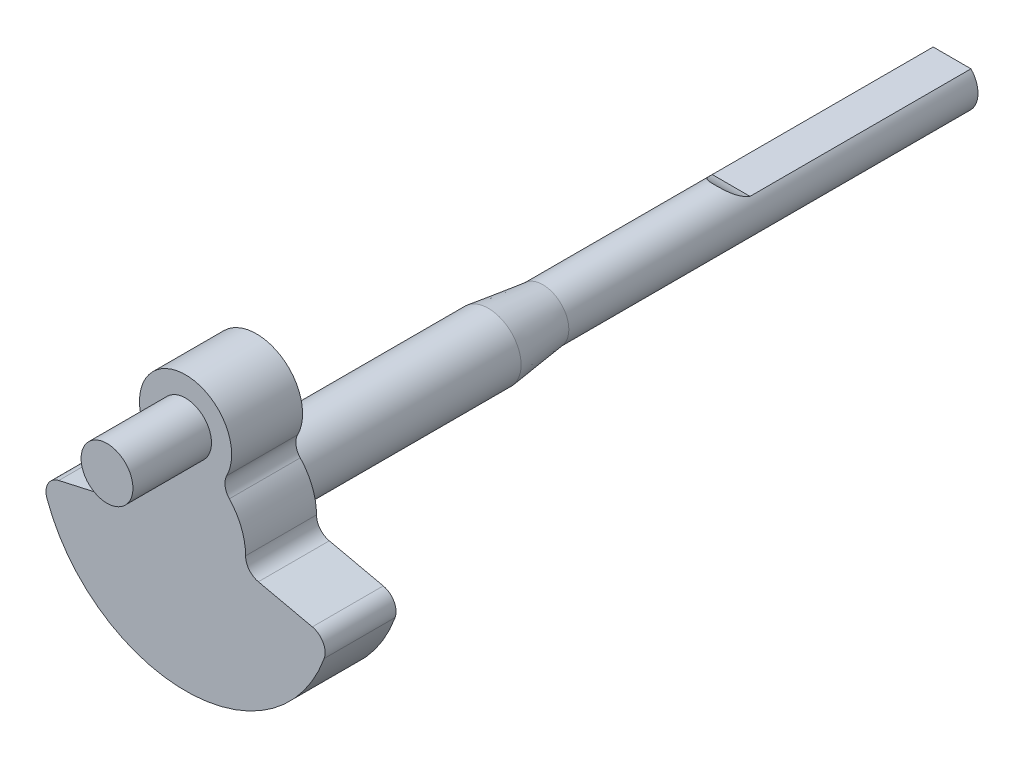
ISO-10303-21;
HEADER;
FILE_DESCRIPTION(('STEP AP214'),'2;1');
FILE_NAME('part.step','',(''),(''),'','','');
FILE_SCHEMA(('AUTOMOTIVE_DESIGN { 1 0 10303 214 1 1 1 1 }'));
ENDSEC;
DATA;
#1=APPLICATION_CONTEXT('core data for automotive mechanical design processes');
#2=APPLICATION_PROTOCOL_DEFINITION('international standard','automotive_design',2000,#1);
#3=PRODUCT_CONTEXT('',#1,'mechanical');
#4=PRODUCT('Part','Part','',(#3));
#5=PRODUCT_RELATED_PRODUCT_CATEGORY('part','',(#4));
#6=PRODUCT_DEFINITION_FORMATION('','',#4);
#7=PRODUCT_DEFINITION_CONTEXT('part definition',#1,'design');
#8=PRODUCT_DEFINITION('design','',#6,#7);
#9=PRODUCT_DEFINITION_SHAPE('','',#8);
#10=(LENGTH_UNIT() NAMED_UNIT(*) SI_UNIT(.MILLI.,.METRE.));
#11=(NAMED_UNIT(*) PLANE_ANGLE_UNIT() SI_UNIT($,.RADIAN.));
#12=(NAMED_UNIT(*) SI_UNIT($,.STERADIAN.) SOLID_ANGLE_UNIT());
#13=UNCERTAINTY_MEASURE_WITH_UNIT(LENGTH_MEASURE(1.E-05),#10,'distance_accuracy_value','');
#14=(GEOMETRIC_REPRESENTATION_CONTEXT(3) GLOBAL_UNCERTAINTY_ASSIGNED_CONTEXT((#13)) GLOBAL_UNIT_ASSIGNED_CONTEXT((#10,
#11,#12)) REPRESENTATION_CONTEXT('',''));
#15=CARTESIAN_POINT('',(0.,0.,0.));
#16=DIRECTION('',(0.,0.,1.));
#17=DIRECTION('',(1.,0.,0.));
#18=AXIS2_PLACEMENT_3D('',#15,#16,#17);
#19=CARTESIAN_POINT('',(0.,0.,-127.5));
#20=DIRECTION('',(0.,0.,1.));
#21=DIRECTION('',(1.,0.,0.));
#22=AXIS2_PLACEMENT_3D('',#19,#20,#21);
#23=CYLINDRICAL_SURFACE('',#22,4.75);
#24=CARTESIAN_POINT('',(0.,0.,-52.4999999999987));
#25=DIRECTION('',(0.,0.,1.));
#26=DIRECTION('',(1.,0.,0.));
#27=AXIS2_PLACEMENT_3D('',#24,#25,#26);
#28=CIRCLE('',#27,4.75);
#29=CARTESIAN_POINT('',(4.75,0.,-52.4999999999987));
#30=VERTEX_POINT('',#29);
#31=EDGE_CURVE('E261',#30,#30,#28,.F.);
#32=ORIENTED_EDGE('',*,*,#31,.T.);
#33=EDGE_LOOP('',(#32));
#34=FACE_BOUND('',#33,.T.);
#35=DIRECTION('',(0.,0.,1.));
#36=VECTOR('',#35,1.);
#37=CARTESIAN_POINT('',(-3.46410161513775,3.25,-127.5));
#38=LINE('',#37,#36);
#39=CARTESIAN_POINT('',(-3.46410161513776,3.25,-127.5));
#40=VERTEX_POINT('',#39);
#41=CARTESIAN_POINT('',(-3.46410161513776,3.24999999999999,-87.));
#42=VERTEX_POINT('',#41);
#43=EDGE_CURVE('E275',#40,#42,#38,.T.);
#44=ORIENTED_EDGE('',*,*,#43,.F.);
#45=CARTESIAN_POINT('',(0.,0.,-127.5));
#46=DIRECTION('',(0.,0.,-1.));
#47=DIRECTION('',(-1.,0.,0.));
#48=AXIS2_PLACEMENT_3D('',#45,#46,#47);
#49=CIRCLE('',#48,4.75);
#50=CARTESIAN_POINT('',(3.46410161513775,3.25,-127.5));
#51=VERTEX_POINT('',#50);
#52=EDGE_CURVE('E269',#51,#40,#49,.T.);
#53=ORIENTED_EDGE('',*,*,#52,.F.);
#54=DIRECTION('',(0.,0.,1.));
#55=VECTOR('',#54,1.);
#56=CARTESIAN_POINT('',(3.46410161513775,3.25,-127.5));
#57=LINE('',#56,#55);
#58=CARTESIAN_POINT('',(3.46410161513776,3.24999999999999,-87.));
#59=VERTEX_POINT('',#58);
#60=EDGE_CURVE('E64',#59,#51,#57,.F.);
#61=ORIENTED_EDGE('',*,*,#60,.F.);
#62=CARTESIAN_POINT('',(-3.46410161513776,3.25,-87.));
#63=CARTESIAN_POINT('',(-3.43611358656672,3.27979775661097,-86.8846666038823));
#64=CARTESIAN_POINT('',(-3.40498893188258,3.31223390667287,-86.7707419579265));
#65=CARTESIAN_POINT('',(-3.33588058216442,3.38184394639069,-86.5463625268658));
#66=CARTESIAN_POINT('',(-3.29789084727832,3.41902199939959,-86.4359108985675));
#67=CARTESIAN_POINT('',(-3.21412829755787,3.49788530254478,-86.2183344076737));
#68=CARTESIAN_POINT('',(-3.16828671376625,3.53960907721346,-86.1112497878732));
#69=CARTESIAN_POINT('',(-3.06849950892516,3.62645662267006,-85.9023855531496));
#70=CARTESIAN_POINT('',(-3.01455595777719,3.67157952358121,-85.8006045921608));
#71=CARTESIAN_POINT('',(-2.89762855673672,3.76455350960341,-85.6025538264111));
#72=CARTESIAN_POINT('',(-2.83458422572851,3.8124214410553,-85.5063274550067));
#73=CARTESIAN_POINT('',(-2.69935669927017,3.90933340161004,-85.3211664226405));
#74=CARTESIAN_POINT('',(-2.6271752791181,3.95837720075025,-85.2322303507198));
#75=CARTESIAN_POINT('',(-2.47381079263751,4.05598124334702,-85.0629680131689));
#76=CARTESIAN_POINT('',(-2.39266656602395,4.10454265078199,-84.982607352075));
#77=CARTESIAN_POINT('',(-2.2212630890206,4.19977268211949,-84.8310013346403));
#78=CARTESIAN_POINT('',(-2.13100609646033,4.24644177087655,-84.7597537302667));
#79=CARTESIAN_POINT('',(-1.95514718036085,4.32989583364553,-84.6364814867839));
#80=CARTESIAN_POINT('',(-1.87067237239763,4.36714835094705,-84.583162445715));
#81=CARTESIAN_POINT('',(-1.69585825188983,4.43795581141628,-84.4842537889336));
#82=CARTESIAN_POINT('',(-1.60552007624485,4.47151146801714,-84.4386626809397));
#83=CARTESIAN_POINT('',(-1.41963505997122,4.53395556058137,-84.3555068687106));
#84=CARTESIAN_POINT('',(-1.32408632348407,4.56284228239777,-84.3179451107358));
#85=CARTESIAN_POINT('',(-1.12867634565008,4.61506354031828,-84.2510972445551));
#86=CARTESIAN_POINT('',(-1.02881570769361,4.63839885030908,-84.2218099827477));
#87=CARTESIAN_POINT('',(-0.840863443947861,4.67581254116995,-84.1753784746137));
#88=CARTESIAN_POINT('',(-0.753225927251665,4.69075093513193,-84.1570769068317));
#89=CARTESIAN_POINT('',(-0.576173030583553,4.71577331190383,-84.1266205967591));
#90=CARTESIAN_POINT('',(-0.486757118191791,4.7258558174554,-84.1144677249681));
#91=CARTESIAN_POINT('',(-0.306956497586903,4.74092920714283,-84.0963572086921));
#92=CARTESIAN_POINT('',(-0.216572725326934,4.74592462787062,-84.09039404422));
#93=CARTESIAN_POINT('',(-0.0354384003106674,4.75073217303994,-84.0846545629147));
#94=CARTESIAN_POINT('',(0.055312273198494,4.75054242352701,-84.0848804828572));
#95=CARTESIAN_POINT('',(0.231926552023828,4.7451152454505,-84.091361073074));
#96=CARTESIAN_POINT('',(0.317808863615958,4.74012917813071,-84.0973155290677));
#97=CARTESIAN_POINT('',(0.488621454889798,4.72558105166763,-84.1148009046019));
#98=CARTESIAN_POINT('',(0.573551391462168,4.71601739434996,-84.1263337717484));
#99=CARTESIAN_POINT('',(0.825914664955215,4.68071485781511,-84.1692727452359));
#100=CARTESIAN_POINT('',(0.991129650328273,4.64835741689224,-84.2090267837639));
#101=CARTESIAN_POINT('',(1.31127754358464,4.56841652240817,-84.3104781842788));
#102=CARTESIAN_POINT('',(1.46617498840006,4.52078352794603,-84.3722470171374));
#103=CARTESIAN_POINT('',(1.76155890624438,4.41407707008864,-84.5167294091499));
#104=CARTESIAN_POINT('',(1.9020441659989,4.35500264471575,-84.5994447296317));
#105=CARTESIAN_POINT('',(2.17264468098275,4.22677839110777,-84.7887484464363));
#106=CARTESIAN_POINT('',(2.30190477506063,4.15727499239018,-84.8963143488301));
#107=CARTESIAN_POINT('',(2.54063240668715,4.01584152946679,-85.1301142002448));
#108=CARTESIAN_POINT('',(2.65009164519804,3.9439104626821,-85.2563559366689));
#109=CARTESIAN_POINT('',(2.8615558615865,3.79378744910102,-85.5407385368023));
#110=CARTESIAN_POINT('',(2.96105129073677,3.71589271813837,-85.70089108511));
#111=CARTESIAN_POINT('',(3.13741278440621,3.56825005678852,-86.036667021173));
#112=CARTESIAN_POINT('',(3.21426665507344,3.49850652847105,-86.2122986794626));
#113=CARTESIAN_POINT('',(3.31722234750928,3.40015051087095,-86.4918066001745));
#114=CARTESIAN_POINT('',(3.35044443305208,3.36733316050734,-86.5916920326621));
#115=CARTESIAN_POINT('',(3.41130720089594,3.30565080612568,-86.7940008901971));
#116=CARTESIAN_POINT('',(3.43896388783552,3.27677454790705,-86.8964160583172));
#117=CARTESIAN_POINT('',(3.46410161513776,3.24999999999999,-87.));
#118=B_SPLINE_CURVE_WITH_KNOTS('',3,(#62,#63,#64,#65,#66,#67,#68,#69,#70,#71,#72,#73,#74,#75,
#76,#77,#78,#79,#80,#81,#82,#83,#84,#85,#86,#87,#88,#89,#90,#91,#92,#93,#94,#95,#96,#97,#98,#99,
#100,#101,#102,#103,#104,#105,#106,#107,#108,#109,#110,#111,#112,#113,#114,#115,#116,#117),
.UNSPECIFIED.,.F.,.F.,(4,2,2,2,2,2,2,2,2,2,2,2,2,2,2,2,2,2,2,2,2,2,2,2,2,2,2,4),(0.,
0.36706526658246,0.734455061100126,1.10524455851908,1.47593948677073,1.84922222265815,
2.22243254228013,2.59408472145046,2.96564504293419,3.28501088056705,3.60431497750073,
3.92373603836305,4.24311254465776,4.51506778804606,4.78710571347947,5.05890082624014,
5.33079416883163,5.58917318356128,5.84764247204984,6.36396364084974,6.88197654429136,
7.40003302037149,7.94368251861516,8.48755934879135,9.09732520026162,9.70741884978436,
10.0379965227109,10.3676095098088),.UNSPECIFIED.);
#119=EDGE_CURVE('E11',#42,#59,#118,.T.);
#120=ORIENTED_EDGE('',*,*,#119,.F.);
#121=EDGE_LOOP('',(#44,#53,#61,#120));
#122=FACE_BOUND('',#121,.T.);
#123=ADVANCED_FACE('F41',(#34,#122),#23,.T.);
#124=CARTESIAN_POINT('',(0.,0.,-127.5));
#125=DIRECTION('',(0.,0.,-1.));
#126=DIRECTION('',(-1.,0.,0.));
#127=AXIS2_PLACEMENT_3D('',#124,#125,#126);
#128=PLANE('',#127);
#129=ORIENTED_EDGE('',*,*,#52,.T.);
#130=DIRECTION('',(1.,0.,0.));
#131=VECTOR('',#130,1.);
#132=CARTESIAN_POINT('',(0.,3.25,-127.5));
#133=LINE('',#132,#131);
#134=EDGE_CURVE('E57',#40,#51,#133,.T.);
#135=ORIENTED_EDGE('',*,*,#134,.T.);
#136=EDGE_LOOP('',(#129,#135));
#137=FACE_BOUND('',#136,.T.);
#138=ADVANCED_FACE('F268',(#137),#128,.T.);
#139=CARTESIAN_POINT('',(22.5818126985761,-8.12783705830947,13.));
#140=DIRECTION('',(0.,0.,1.));
#141=DIRECTION('',(1.,0.,0.));
#142=AXIS2_PLACEMENT_3D('',#139,#140,#141);
#143=PLANE('',#142);
#144=CARTESIAN_POINT('',(22.5818126985761,-8.12783705830947,13.));
#145=DIRECTION('',(0.,0.,1.));
#146=DIRECTION('',(1.,0.,0.));
#147=AXIS2_PLACEMENT_3D('',#144,#145,#146);
#148=CIRCLE('',#147,3.);
#149=CARTESIAN_POINT('',(25.4045392858981,-9.14381669059816,13.));
#150=VERTEX_POINT('',#149);
#151=CARTESIAN_POINT('',(23.2369829167143,-5.20025239082936,13.));
#152=VERTEX_POINT('',#151);
#153=EDGE_CURVE('E223',#150,#152,#148,.T.);
#154=ORIENTED_EDGE('',*,*,#153,.T.);
#155=DIRECTION('',(-0.975861555826705,0.218390072712755,0.));
#156=VECTOR('',#155,1.);
#157=CARTESIAN_POINT('',(13.3447060716329,-2.98643932831779,13.));
#158=LINE('',#157,#156);
#159=CARTESIAN_POINT('',(13.3447060716329,-2.98643932831778,13.));
#160=VERTEX_POINT('',#159);
#161=EDGE_CURVE('E127',#152,#160,#158,.T.);
#162=ORIENTED_EDGE('',*,*,#161,.T.);
#163=CARTESIAN_POINT('',(13.9998762897712,-0.0588546608376699,13.));
#164=DIRECTION('',(0.,0.,-1.));
#165=DIRECTION('',(-1.,0.,0.));
#166=AXIS2_PLACEMENT_3D('',#163,#164,#165);
#167=CIRCLE('',#166,3.);
#168=CARTESIAN_POINT('',(10.9999027991059,-0.0462429478010245,13.));
#169=VERTEX_POINT('',#168);
#170=EDGE_CURVE('E301',#160,#169,#167,.T.);
#171=ORIENTED_EDGE('',*,*,#170,.T.);
#172=CARTESIAN_POINT('',(0.,0.,13.));
#173=DIRECTION('',(0.,0.,1.));
#174=DIRECTION('',(1.,0.,0.));
#175=AXIS2_PLACEMENT_3D('',#172,#173,#174);
#176=CIRCLE('',#175,11.);
#177=CARTESIAN_POINT('',(8.02510116370055,7.52314769975787,13.));
#178=VERTEX_POINT('',#177);
#179=EDGE_CURVE('E304',#169,#178,#176,.T.);
#180=ORIENTED_EDGE('',*,*,#179,.T.);
#181=CARTESIAN_POINT('',(10.2137651174371,9.57491525423729,13.));
#182=DIRECTION('',(0.,0.,-1.));
#183=DIRECTION('',(-1.,0.,0.));
#184=AXIS2_PLACEMENT_3D('',#181,#182,#183);
#185=CIRCLE('',#184,3.);
#186=CARTESIAN_POINT('',(7.53766945347975,10.9308326548738,13.));
#187=VERTEX_POINT('',#186);
#188=EDGE_CURVE('E307',#178,#187,#185,.T.);
#189=ORIENTED_EDGE('',*,*,#188,.T.);
#190=CARTESIAN_POINT('',(0.,14.75,13.));
#191=DIRECTION('',(0.,0.,1.));
#192=DIRECTION('',(1.,0.,0.));
#193=AXIS2_PLACEMENT_3D('',#190,#191,#192);
#194=CIRCLE('',#193,8.45);
#195=CARTESIAN_POINT('',(-7.53766945347975,10.9308326548738,13.));
#196=VERTEX_POINT('',#195);
#197=EDGE_CURVE('E310',#187,#196,#194,.T.);
#198=ORIENTED_EDGE('',*,*,#197,.T.);
#199=CARTESIAN_POINT('',(-10.2137651174371,9.57491525423729,13.));
#200=DIRECTION('',(0.,0.,-1.));
#201=DIRECTION('',(1.,0.,0.));
#202=AXIS2_PLACEMENT_3D('',#199,#200,#201);
#203=CIRCLE('',#202,3.);
#204=CARTESIAN_POINT('',(-8.02510116370055,7.52314769975787,13.));
#205=VERTEX_POINT('',#204);
#206=EDGE_CURVE('E313',#196,#205,#203,.T.);
#207=ORIENTED_EDGE('',*,*,#206,.T.);
#208=CARTESIAN_POINT('',(0.,0.,13.));
#209=DIRECTION('',(0.,0.,1.));
#210=DIRECTION('',(1.,0.,0.));
#211=AXIS2_PLACEMENT_3D('',#208,#209,#210);
#212=CIRCLE('',#211,11.);
#213=CARTESIAN_POINT('',(-10.9999027991059,-0.0462429478010262,13.));
#214=VERTEX_POINT('',#213);
#215=EDGE_CURVE('E316',#205,#214,#212,.T.);
#216=ORIENTED_EDGE('',*,*,#215,.T.);
#217=CARTESIAN_POINT('',(-13.9998762897712,-0.0588546608376685,13.));
#218=DIRECTION('',(0.,0.,-1.));
#219=DIRECTION('',(1.,0.,0.));
#220=AXIS2_PLACEMENT_3D('',#217,#218,#219);
#221=CIRCLE('',#220,3.);
#222=CARTESIAN_POINT('',(-13.3447060716329,-2.98643932831778,13.));
#223=VERTEX_POINT('',#222);
#224=EDGE_CURVE('E162',#214,#223,#221,.T.);
#225=ORIENTED_EDGE('',*,*,#224,.T.);
#226=DIRECTION('',(-0.975861555826705,-0.218390072712755,0.));
#227=VECTOR('',#226,1.);
#228=CARTESIAN_POINT('',(-23.2369829167143,-5.20025239082936,13.));
#229=LINE('',#228,#227);
#230=CARTESIAN_POINT('',(-23.2369829167143,-5.20025239082936,13.));
#231=VERTEX_POINT('',#230);
#232=EDGE_CURVE('E154',#223,#231,#229,.T.);
#233=ORIENTED_EDGE('',*,*,#232,.T.);
#234=CARTESIAN_POINT('',(-22.5818126985761,-8.12783705830947,13.));
#235=DIRECTION('',(0.,0.,1.));
#236=DIRECTION('',(1.,0.,0.));
#237=AXIS2_PLACEMENT_3D('',#234,#235,#236);
#238=CIRCLE('',#237,3.);
#239=CARTESIAN_POINT('',(-25.4045392858981,-9.14381669059815,13.));
#240=VERTEX_POINT('',#239);
#241=EDGE_CURVE('E159',#231,#240,#238,.T.);
#242=ORIENTED_EDGE('',*,*,#241,.T.);
#243=CARTESIAN_POINT('',(0.,0.,13.));
#244=DIRECTION('',(0.,0.,1.));
#245=DIRECTION('',(1.,0.,0.));
#246=AXIS2_PLACEMENT_3D('',#243,#244,#245);
#247=CIRCLE('',#246,27.);
#248=EDGE_CURVE('E73',#240,#150,#247,.T.);
#249=ORIENTED_EDGE('',*,*,#248,.T.);
#250=EDGE_LOOP('',(#154,#162,#171,#180,#189,#198,#207,#216,#225,#233,#242,#249));
#251=FACE_BOUND('',#250,.T.);
#252=CARTESIAN_POINT('',(0.,14.75,13.));
#253=DIRECTION('',(0.,0.,1.));
#254=DIRECTION('',(1.,0.,0.));
#255=AXIS2_PLACEMENT_3D('',#252,#253,#254);
#256=CIRCLE('',#255,4.75);
#257=CARTESIAN_POINT('',(4.75,14.75,13.));
#258=VERTEX_POINT('',#257);
#259=EDGE_CURVE('E192',#258,#258,#256,.T.);
#260=ORIENTED_EDGE('',*,*,#259,.F.);
#261=EDGE_LOOP('',(#260));
#262=FACE_BOUND('',#261,.T.);
#263=ADVANCED_FACE('F156',(#251,#262),#143,.T.);
#264=CARTESIAN_POINT('',(22.5818126985761,-8.12783705830947,0.));
#265=DIRECTION('',(0.,0.,1.));
#266=DIRECTION('',(1.,0.,0.));
#267=AXIS2_PLACEMENT_3D('',#264,#265,#266);
#268=PLANE('',#267);
#269=CARTESIAN_POINT('',(22.5818126985761,-8.12783705830947,0.));
#270=DIRECTION('',(0.,0.,1.));
#271=DIRECTION('',(1.,0.,0.));
#272=AXIS2_PLACEMENT_3D('',#269,#270,#271);
#273=CIRCLE('',#272,3.);
#274=CARTESIAN_POINT('',(25.4045392858981,-9.14381669059816,0.));
#275=VERTEX_POINT('',#274);
#276=CARTESIAN_POINT('',(23.2369829167143,-5.20025239082936,0.));
#277=VERTEX_POINT('',#276);
#278=EDGE_CURVE('E187',#275,#277,#273,.T.);
#279=ORIENTED_EDGE('',*,*,#278,.F.);
#280=CARTESIAN_POINT('',(0.,0.,0.));
#281=DIRECTION('',(0.,0.,1.));
#282=DIRECTION('',(1.,0.,0.));
#283=AXIS2_PLACEMENT_3D('',#280,#281,#282);
#284=CIRCLE('',#283,27.);
#285=CARTESIAN_POINT('',(-25.4045392858981,-9.14381669059815,0.));
#286=VERTEX_POINT('',#285);
#287=EDGE_CURVE('E118',#286,#275,#284,.T.);
#288=ORIENTED_EDGE('',*,*,#287,.F.);
#289=CARTESIAN_POINT('',(-22.5818126985761,-8.12783705830947,0.));
#290=DIRECTION('',(0.,0.,1.));
#291=DIRECTION('',(1.,0.,0.));
#292=AXIS2_PLACEMENT_3D('',#289,#290,#291);
#293=CIRCLE('',#292,3.);
#294=CARTESIAN_POINT('',(-23.2369829167143,-5.20025239082936,0.));
#295=VERTEX_POINT('',#294);
#296=EDGE_CURVE('E218',#295,#286,#293,.T.);
#297=ORIENTED_EDGE('',*,*,#296,.F.);
#298=DIRECTION('',(-0.975861555826705,-0.218390072712755,0.));
#299=VECTOR('',#298,1.);
#300=CARTESIAN_POINT('',(-23.2369829167143,-5.20025239082936,0.));
#301=LINE('',#300,#299);
#302=CARTESIAN_POINT('',(-13.3447060716329,-2.98643932831778,0.));
#303=VERTEX_POINT('',#302);
#304=EDGE_CURVE('E172',#303,#295,#301,.T.);
#305=ORIENTED_EDGE('',*,*,#304,.F.);
#306=CARTESIAN_POINT('',(-13.9998762897712,-0.0588546608376685,0.));
#307=DIRECTION('',(0.,0.,-1.));
#308=DIRECTION('',(1.,0.,0.));
#309=AXIS2_PLACEMENT_3D('',#306,#307,#308);
#310=CIRCLE('',#309,3.);
#311=CARTESIAN_POINT('',(-10.9999027991059,-0.0462429478010262,0.));
#312=VERTEX_POINT('',#311);
#313=EDGE_CURVE('E213',#312,#303,#310,.T.);
#314=ORIENTED_EDGE('',*,*,#313,.F.);
#315=CARTESIAN_POINT('',(0.,0.,0.));
#316=DIRECTION('',(0.,0.,1.));
#317=DIRECTION('',(1.,0.,0.));
#318=AXIS2_PLACEMENT_3D('',#315,#316,#317);
#319=CIRCLE('',#318,11.);
#320=CARTESIAN_POINT('',(-8.02510116370055,7.52314769975787,0.));
#321=VERTEX_POINT('',#320);
#322=EDGE_CURVE('E210',#321,#312,#319,.T.);
#323=ORIENTED_EDGE('',*,*,#322,.F.);
#324=CARTESIAN_POINT('',(-10.2137651174371,9.57491525423729,0.));
#325=DIRECTION('',(0.,0.,-1.));
#326=DIRECTION('',(1.,0.,0.));
#327=AXIS2_PLACEMENT_3D('',#324,#325,#326);
#328=CIRCLE('',#327,3.);
#329=CARTESIAN_POINT('',(-7.53766945347975,10.9308326548738,0.));
#330=VERTEX_POINT('',#329);
#331=EDGE_CURVE('E207',#330,#321,#328,.T.);
#332=ORIENTED_EDGE('',*,*,#331,.F.);
#333=CARTESIAN_POINT('',(0.,14.75,0.));
#334=DIRECTION('',(0.,0.,1.));
#335=DIRECTION('',(1.,0.,0.));
#336=AXIS2_PLACEMENT_3D('',#333,#334,#335);
#337=CIRCLE('',#336,8.45);
#338=CARTESIAN_POINT('',(7.53766945347975,10.9308326548738,0.));
#339=VERTEX_POINT('',#338);
#340=EDGE_CURVE('E204',#339,#330,#337,.T.);
#341=ORIENTED_EDGE('',*,*,#340,.F.);
#342=CARTESIAN_POINT('',(10.2137651174371,9.57491525423729,0.));
#343=DIRECTION('',(0.,0.,-1.));
#344=DIRECTION('',(-1.,0.,0.));
#345=AXIS2_PLACEMENT_3D('',#342,#343,#344);
#346=CIRCLE('',#345,3.);
#347=CARTESIAN_POINT('',(8.02510116370055,7.52314769975787,0.));
#348=VERTEX_POINT('',#347);
#349=EDGE_CURVE('E201',#348,#339,#346,.T.);
#350=ORIENTED_EDGE('',*,*,#349,.F.);
#351=CARTESIAN_POINT('',(0.,0.,0.));
#352=DIRECTION('',(0.,0.,1.));
#353=DIRECTION('',(1.,0.,0.));
#354=AXIS2_PLACEMENT_3D('',#351,#352,#353);
#355=CIRCLE('',#354,11.);
#356=CARTESIAN_POINT('',(10.9999027991059,-0.0462429478010245,0.));
#357=VERTEX_POINT('',#356);
#358=EDGE_CURVE('E198',#357,#348,#355,.T.);
#359=ORIENTED_EDGE('',*,*,#358,.F.);
#360=CARTESIAN_POINT('',(13.9998762897712,-0.0588546608376699,0.));
#361=DIRECTION('',(0.,0.,-1.));
#362=DIRECTION('',(-1.,0.,0.));
#363=AXIS2_PLACEMENT_3D('',#360,#361,#362);
#364=CIRCLE('',#363,3.);
#365=CARTESIAN_POINT('',(13.3447060716329,-2.98643932831778,0.));
#366=VERTEX_POINT('',#365);
#367=EDGE_CURVE('E195',#366,#357,#364,.T.);
#368=ORIENTED_EDGE('',*,*,#367,.F.);
#369=DIRECTION('',(-0.975861555826705,0.218390072712755,0.));
#370=VECTOR('',#369,1.);
#371=CARTESIAN_POINT('',(13.3447060716329,-2.98643932831779,0.));
#372=LINE('',#371,#370);
#373=EDGE_CURVE('E191',#277,#366,#372,.T.);
#374=ORIENTED_EDGE('',*,*,#373,.F.);
#375=EDGE_LOOP('',(#279,#288,#297,#305,#314,#323,#332,#341,#350,#359,#368,#374));
#376=FACE_BOUND('',#375,.T.);
#377=CARTESIAN_POINT('',(0.,0.,0.));
#378=DIRECTION('',(0.,0.,1.));
#379=DIRECTION('',(1.,0.,0.));
#380=AXIS2_PLACEMENT_3D('',#377,#378,#379);
#381=CIRCLE('',#380,6.);
#382=CARTESIAN_POINT('',(6.,0.,0.));
#383=VERTEX_POINT('',#382);
#384=EDGE_CURVE('E282',#383,#383,#381,.T.);
#385=ORIENTED_EDGE('',*,*,#384,.T.);
#386=EDGE_LOOP('',(#385));
#387=FACE_BOUND('',#386,.T.);
#388=ADVANCED_FACE('F331',(#376,#387),#268,.F.);
#389=CARTESIAN_POINT('',(22.5818126985761,-8.12783705830947,13.));
#390=DIRECTION('',(0.,0.,-1.));
#391=DIRECTION('',(-1.,0.,0.));
#392=AXIS2_PLACEMENT_3D('',#389,#390,#391);
#393=CYLINDRICAL_SURFACE('',#392,3.);
#394=ORIENTED_EDGE('',*,*,#278,.T.);
#395=DIRECTION('',(0.,0.,-1.));
#396=VECTOR('',#395,1.);
#397=CARTESIAN_POINT('',(23.2369829167143,-5.20025239082936,13.));
#398=LINE('',#397,#396);
#399=EDGE_CURVE('E258',#152,#277,#398,.T.);
#400=ORIENTED_EDGE('',*,*,#399,.F.);
#401=ORIENTED_EDGE('',*,*,#153,.F.);
#402=DIRECTION('',(0.,0.,-1.));
#403=VECTOR('',#402,1.);
#404=CARTESIAN_POINT('',(25.4045392858981,-9.14381669059816,13.));
#405=LINE('',#404,#403);
#406=EDGE_CURVE('E183',#150,#275,#405,.T.);
#407=ORIENTED_EDGE('',*,*,#406,.T.);
#408=EDGE_LOOP('',(#394,#400,#401,#407));
#409=FACE_BOUND('',#408,.T.);
#410=ADVANCED_FACE('F337',(#409),#393,.T.);
#411=CARTESIAN_POINT('',(13.3447060716329,-2.98643932831779,13.));
#412=DIRECTION('',(-0.218390072712755,-0.975861555826705,0.));
#413=DIRECTION('',(0.975861555826705,-0.218390072712755,0.));
#414=AXIS2_PLACEMENT_3D('',#411,#412,#413);
#415=PLANE('',#414);
#416=ORIENTED_EDGE('',*,*,#373,.T.);
#417=DIRECTION('',(0.,0.,-1.));
#418=VECTOR('',#417,1.);
#419=CARTESIAN_POINT('',(13.3447060716329,-2.98643932831778,13.));
#420=LINE('',#419,#418);
#421=EDGE_CURVE('E254',#160,#366,#420,.T.);
#422=ORIENTED_EDGE('',*,*,#421,.F.);
#423=ORIENTED_EDGE('',*,*,#161,.F.);
#424=ORIENTED_EDGE('',*,*,#399,.T.);
#425=EDGE_LOOP('',(#416,#422,#423,#424));
#426=FACE_BOUND('',#425,.T.);
#427=ADVANCED_FACE('F340',(#426),#415,.F.);
#428=CARTESIAN_POINT('',(13.9998762897712,-0.0588546608376699,13.));
#429=DIRECTION('',(0.,0.,-1.));
#430=DIRECTION('',(-1.,0.,0.));
#431=AXIS2_PLACEMENT_3D('',#428,#429,#430);
#432=CYLINDRICAL_SURFACE('',#431,3.);
#433=ORIENTED_EDGE('',*,*,#367,.T.);
#434=DIRECTION('',(0.,0.,-1.));
#435=VECTOR('',#434,1.);
#436=CARTESIAN_POINT('',(10.9999027991059,-0.0462429478010245,13.));
#437=LINE('',#436,#435);
#438=EDGE_CURVE('E250',#169,#357,#437,.T.);
#439=ORIENTED_EDGE('',*,*,#438,.F.);
#440=ORIENTED_EDGE('',*,*,#170,.F.);
#441=ORIENTED_EDGE('',*,*,#421,.T.);
#442=EDGE_LOOP('',(#433,#439,#440,#441));
#443=FACE_BOUND('',#442,.T.);
#444=ADVANCED_FACE('F343',(#443),#432,.F.);
#445=CARTESIAN_POINT('',(0.,0.,13.));
#446=DIRECTION('',(0.,0.,-1.));
#447=DIRECTION('',(-1.,0.,0.));
#448=AXIS2_PLACEMENT_3D('',#445,#446,#447);
#449=CYLINDRICAL_SURFACE('',#448,11.);
#450=ORIENTED_EDGE('',*,*,#358,.T.);
#451=DIRECTION('',(0.,0.,-1.));
#452=VECTOR('',#451,1.);
#453=CARTESIAN_POINT('',(8.02510116370055,7.52314769975787,13.));
#454=LINE('',#453,#452);
#455=EDGE_CURVE('E246',#178,#348,#454,.T.);
#456=ORIENTED_EDGE('',*,*,#455,.F.);
#457=ORIENTED_EDGE('',*,*,#179,.F.);
#458=ORIENTED_EDGE('',*,*,#438,.T.);
#459=EDGE_LOOP('',(#450,#456,#457,#458));
#460=FACE_BOUND('',#459,.T.);
#461=ADVANCED_FACE('F348',(#460),#449,.T.);
#462=CARTESIAN_POINT('',(10.2137651174371,9.57491525423729,13.));
#463=DIRECTION('',(0.,0.,-1.));
#464=DIRECTION('',(-1.,0.,0.));
#465=AXIS2_PLACEMENT_3D('',#462,#463,#464);
#466=CYLINDRICAL_SURFACE('',#465,3.);
#467=ORIENTED_EDGE('',*,*,#349,.T.);
#468=DIRECTION('',(0.,0.,-1.));
#469=VECTOR('',#468,1.);
#470=CARTESIAN_POINT('',(7.53766945347975,10.9308326548738,13.));
#471=LINE('',#470,#469);
#472=EDGE_CURVE('E242',#187,#339,#471,.T.);
#473=ORIENTED_EDGE('',*,*,#472,.F.);
#474=ORIENTED_EDGE('',*,*,#188,.F.);
#475=ORIENTED_EDGE('',*,*,#455,.T.);
#476=EDGE_LOOP('',(#467,#473,#474,#475));
#477=FACE_BOUND('',#476,.T.);
#478=ADVANCED_FACE('F354',(#477),#466,.F.);
#479=CARTESIAN_POINT('',(0.,14.75,13.));
#480=DIRECTION('',(0.,0.,-1.));
#481=DIRECTION('',(-1.,0.,0.));
#482=AXIS2_PLACEMENT_3D('',#479,#480,#481);
#483=CYLINDRICAL_SURFACE('',#482,8.45);
#484=ORIENTED_EDGE('',*,*,#340,.T.);
#485=DIRECTION('',(0.,0.,-1.));
#486=VECTOR('',#485,1.);
#487=CARTESIAN_POINT('',(-7.53766945347975,10.9308326548738,13.));
#488=LINE('',#487,#486);
#489=EDGE_CURVE('E238',#196,#330,#488,.T.);
#490=ORIENTED_EDGE('',*,*,#489,.F.);
#491=ORIENTED_EDGE('',*,*,#197,.F.);
#492=ORIENTED_EDGE('',*,*,#472,.T.);
#493=EDGE_LOOP('',(#484,#490,#491,#492));
#494=FACE_BOUND('',#493,.T.);
#495=ADVANCED_FACE('F358',(#494),#483,.T.);
#496=CARTESIAN_POINT('',(-10.2137651174371,9.57491525423729,13.));
#497=DIRECTION('',(0.,0.,-1.));
#498=DIRECTION('',(-1.,0.,0.));
#499=AXIS2_PLACEMENT_3D('',#496,#497,#498);
#500=CYLINDRICAL_SURFACE('',#499,3.);
#501=ORIENTED_EDGE('',*,*,#331,.T.);
#502=DIRECTION('',(0.,0.,-1.));
#503=VECTOR('',#502,1.);
#504=CARTESIAN_POINT('',(-8.02510116370055,7.52314769975787,13.));
#505=LINE('',#504,#503);
#506=EDGE_CURVE('E234',#205,#321,#505,.T.);
#507=ORIENTED_EDGE('',*,*,#506,.F.);
#508=ORIENTED_EDGE('',*,*,#206,.F.);
#509=ORIENTED_EDGE('',*,*,#489,.T.);
#510=EDGE_LOOP('',(#501,#507,#508,#509));
#511=FACE_BOUND('',#510,.T.);
#512=ADVANCED_FACE('F361',(#511),#500,.F.);
#513=CARTESIAN_POINT('',(0.,0.,13.));
#514=DIRECTION('',(0.,0.,-1.));
#515=DIRECTION('',(-1.,0.,0.));
#516=AXIS2_PLACEMENT_3D('',#513,#514,#515);
#517=CYLINDRICAL_SURFACE('',#516,11.);
#518=ORIENTED_EDGE('',*,*,#322,.T.);
#519=DIRECTION('',(0.,0.,-1.));
#520=VECTOR('',#519,1.);
#521=CARTESIAN_POINT('',(-10.9999027991059,-0.0462429478010262,13.));
#522=LINE('',#521,#520);
#523=EDGE_CURVE('E230',#214,#312,#522,.T.);
#524=ORIENTED_EDGE('',*,*,#523,.F.);
#525=ORIENTED_EDGE('',*,*,#215,.F.);
#526=ORIENTED_EDGE('',*,*,#506,.T.);
#527=EDGE_LOOP('',(#518,#524,#525,#526));
#528=FACE_BOUND('',#527,.T.);
#529=ADVANCED_FACE('F324',(#528),#517,.T.);
#530=CARTESIAN_POINT('',(-13.9998762897712,-0.0588546608376685,13.));
#531=DIRECTION('',(0.,0.,-1.));
#532=DIRECTION('',(-1.,0.,0.));
#533=AXIS2_PLACEMENT_3D('',#530,#531,#532);
#534=CYLINDRICAL_SURFACE('',#533,3.);
#535=ORIENTED_EDGE('',*,*,#313,.T.);
#536=DIRECTION('',(0.,0.,-1.));
#537=VECTOR('',#536,1.);
#538=CARTESIAN_POINT('',(-13.3447060716329,-2.98643932831778,13.));
#539=LINE('',#538,#537);
#540=EDGE_CURVE('E176',#223,#303,#539,.T.);
#541=ORIENTED_EDGE('',*,*,#540,.F.);
#542=ORIENTED_EDGE('',*,*,#224,.F.);
#543=ORIENTED_EDGE('',*,*,#523,.T.);
#544=EDGE_LOOP('',(#535,#541,#542,#543));
#545=FACE_BOUND('',#544,.T.);
#546=ADVANCED_FACE('F328',(#545),#534,.F.);
#547=CARTESIAN_POINT('',(-23.2369829167143,-5.20025239082936,13.));
#548=DIRECTION('',(0.218390072712755,-0.975861555826705,0.));
#549=DIRECTION('',(0.975861555826705,0.218390072712755,0.));
#550=AXIS2_PLACEMENT_3D('',#547,#548,#549);
#551=PLANE('',#550);
#552=ORIENTED_EDGE('',*,*,#304,.T.);
#553=DIRECTION('',(0.,0.,-1.));
#554=VECTOR('',#553,1.);
#555=CARTESIAN_POINT('',(-23.2369829167143,-5.20025239082936,13.));
#556=LINE('',#555,#554);
#557=EDGE_CURVE('E169',#231,#295,#556,.T.);
#558=ORIENTED_EDGE('',*,*,#557,.F.);
#559=ORIENTED_EDGE('',*,*,#232,.F.);
#560=ORIENTED_EDGE('',*,*,#540,.T.);
#561=EDGE_LOOP('',(#552,#558,#559,#560));
#562=FACE_BOUND('',#561,.T.);
#563=ADVANCED_FACE('F170',(#562),#551,.F.);
#564=CARTESIAN_POINT('',(-22.5818126985761,-8.12783705830947,13.));
#565=DIRECTION('',(0.,0.,-1.));
#566=DIRECTION('',(-1.,0.,0.));
#567=AXIS2_PLACEMENT_3D('',#564,#565,#566);
#568=CYLINDRICAL_SURFACE('',#567,3.);
#569=ORIENTED_EDGE('',*,*,#296,.T.);
#570=DIRECTION('',(0.,0.,-1.));
#571=VECTOR('',#570,1.);
#572=CARTESIAN_POINT('',(-25.4045392858981,-9.14381669059815,13.));
#573=LINE('',#572,#571);
#574=EDGE_CURVE('E177',#240,#286,#573,.T.);
#575=ORIENTED_EDGE('',*,*,#574,.F.);
#576=ORIENTED_EDGE('',*,*,#241,.F.);
#577=ORIENTED_EDGE('',*,*,#557,.T.);
#578=EDGE_LOOP('',(#569,#575,#576,#577));
#579=FACE_BOUND('',#578,.T.);
#580=ADVANCED_FACE('F179',(#579),#568,.T.);
#581=CARTESIAN_POINT('',(0.,0.,13.));
#582=DIRECTION('',(0.,0.,-1.));
#583=DIRECTION('',(-1.,0.,0.));
#584=AXIS2_PLACEMENT_3D('',#581,#582,#583);
#585=CYLINDRICAL_SURFACE('',#584,27.);
#586=ORIENTED_EDGE('',*,*,#287,.T.);
#587=ORIENTED_EDGE('',*,*,#406,.F.);
#588=ORIENTED_EDGE('',*,*,#248,.F.);
#589=ORIENTED_EDGE('',*,*,#574,.T.);
#590=EDGE_LOOP('',(#586,#587,#588,#589));
#591=FACE_BOUND('',#590,.T.);
#592=ADVANCED_FACE('F333',(#591),#585,.T.);
#593=CARTESIAN_POINT('',(0.,14.75,0.));
#594=DIRECTION('',(0.,0.,1.));
#595=DIRECTION('',(1.,0.,0.));
#596=AXIS2_PLACEMENT_3D('',#593,#594,#595);
#597=CYLINDRICAL_SURFACE('',#596,4.75);
#598=CARTESIAN_POINT('',(0.,14.75,27.4));
#599=DIRECTION('',(0.,0.,1.));
#600=DIRECTION('',(1.,0.,0.));
#601=AXIS2_PLACEMENT_3D('',#598,#599,#600);
#602=CIRCLE('',#601,4.75);
#603=CARTESIAN_POINT('',(4.75,14.75,27.4));
#604=VERTEX_POINT('',#603);
#605=EDGE_CURVE('E290',#604,#604,#602,.T.);
#606=CARTESIAN_POINT('',(4.75,14.75,13.));
#607=CARTESIAN_POINT('',(4.75,14.75,13.15));
#608=CARTESIAN_POINT('',(4.75,14.75,13.3));
#609=CARTESIAN_POINT('',(4.75,14.75,13.6));
#610=CARTESIAN_POINT('',(4.75,14.75,13.75));
#611=CARTESIAN_POINT('',(4.75,14.75,14.05));
#612=CARTESIAN_POINT('',(4.75,14.75,14.2));
#613=CARTESIAN_POINT('',(4.75,14.75,14.5));
#614=CARTESIAN_POINT('',(4.75,14.75,14.65));
#615=CARTESIAN_POINT('',(4.75,14.75,14.95));
#616=CARTESIAN_POINT('',(4.75,14.75,15.1));
#617=CARTESIAN_POINT('',(4.75,14.75,15.4));
#618=CARTESIAN_POINT('',(4.75,14.75,15.55));
#619=CARTESIAN_POINT('',(4.75,14.75,15.85));
#620=CARTESIAN_POINT('',(4.75,14.75,16.));
#621=CARTESIAN_POINT('',(4.75,14.75,16.3));
#622=CARTESIAN_POINT('',(4.75,14.75,16.45));
#623=CARTESIAN_POINT('',(4.75,14.75,16.75));
#624=CARTESIAN_POINT('',(4.75,14.75,16.9));
#625=CARTESIAN_POINT('',(4.75,14.75,17.2));
#626=CARTESIAN_POINT('',(4.75,14.75,17.35));
#627=CARTESIAN_POINT('',(4.75,14.75,17.65));
#628=CARTESIAN_POINT('',(4.75,14.75,17.8));
#629=CARTESIAN_POINT('',(4.75,14.75,18.1));
#630=CARTESIAN_POINT('',(4.75,14.75,18.25));
#631=CARTESIAN_POINT('',(4.75,14.75,18.55));
#632=CARTESIAN_POINT('',(4.75,14.75,18.7));
#633=CARTESIAN_POINT('',(4.75,14.75,19.));
#634=CARTESIAN_POINT('',(4.75,14.75,19.15));
#635=CARTESIAN_POINT('',(4.75,14.75,19.45));
#636=CARTESIAN_POINT('',(4.75,14.75,19.6));
#637=CARTESIAN_POINT('',(4.75,14.75,19.9));
#638=CARTESIAN_POINT('',(4.75,14.75,20.05));
#639=CARTESIAN_POINT('',(4.75,14.75,20.35));
#640=CARTESIAN_POINT('',(4.75,14.75,20.5));
#641=CARTESIAN_POINT('',(4.75,14.75,20.8));
#642=CARTESIAN_POINT('',(4.75,14.75,20.95));
#643=CARTESIAN_POINT('',(4.75,14.75,21.25));
#644=CARTESIAN_POINT('',(4.75,14.75,21.4));
#645=CARTESIAN_POINT('',(4.75,14.75,21.7));
#646=CARTESIAN_POINT('',(4.75,14.75,21.85));
#647=CARTESIAN_POINT('',(4.75,14.75,22.15));
#648=CARTESIAN_POINT('',(4.75,14.75,22.3));
#649=CARTESIAN_POINT('',(4.75,14.75,22.6));
#650=CARTESIAN_POINT('',(4.75,14.75,22.75));
#651=CARTESIAN_POINT('',(4.75,14.75,23.05));
#652=CARTESIAN_POINT('',(4.75,14.75,23.2));
#653=CARTESIAN_POINT('',(4.75,14.75,23.5));
#654=CARTESIAN_POINT('',(4.75,14.75,23.65));
#655=CARTESIAN_POINT('',(4.75,14.75,23.95));
#656=CARTESIAN_POINT('',(4.75,14.75,24.1));
#657=CARTESIAN_POINT('',(4.75,14.75,24.4));
#658=CARTESIAN_POINT('',(4.75,14.75,24.55));
#659=CARTESIAN_POINT('',(4.75,14.75,24.85));
#660=CARTESIAN_POINT('',(4.75,14.75,25.));
#661=CARTESIAN_POINT('',(4.75,14.75,25.3));
#662=CARTESIAN_POINT('',(4.75,14.75,25.45));
#663=CARTESIAN_POINT('',(4.75,14.75,25.75));
#664=CARTESIAN_POINT('',(4.75,14.75,25.9));
#665=CARTESIAN_POINT('',(4.75,14.75,26.2));
#666=CARTESIAN_POINT('',(4.75,14.75,26.35));
#667=CARTESIAN_POINT('',(4.75,14.75,26.65));
#668=CARTESIAN_POINT('',(4.75,14.75,26.8));
#669=CARTESIAN_POINT('',(4.75,14.75,27.1));
#670=CARTESIAN_POINT('',(4.75,14.75,27.25));
#671=CARTESIAN_POINT('',(4.75,14.75,27.4));
#672=B_SPLINE_CURVE_WITH_KNOTS('',3,(#606,#607,#608,#609,#610,#611,#612,#613,#614,#615,#616,
#617,#618,#619,#620,#621,#622,#623,#624,#625,#626,#627,#628,#629,#630,#631,#632,#633,#634,#635,
#636,#637,#638,#639,#640,#641,#642,#643,#644,#645,#646,#647,#648,#649,#650,#651,#652,#653,#654,
#655,#656,#657,#658,#659,#660,#661,#662,#663,#664,#665,#666,#667,#668,#669,#670,#671),
.UNSPECIFIED.,.F.,.F.,(4,2,2,2,2,2,2,2,2,2,2,2,2,2,2,2,2,2,2,2,2,2,2,2,2,2,2,2,2,2,2,2,4),(0.,
0.450000000000001,0.9,1.35,1.8,2.25,2.7,3.15,3.6,4.05,4.5,4.95,5.4,5.85,6.3,6.75,7.2,7.65,8.1,
8.55,9.,9.45,9.9,10.35,10.8,11.25,11.7,12.15,12.6,13.05,13.5,13.95,14.4),.UNSPECIFIED.);
#673=EDGE_CURVE('BSEAM385',#258,#604,#672,.T.);
#674=ORIENTED_EDGE('',*,*,#259,.T.);
#675=ORIENTED_EDGE('',*,*,#605,.F.);
#676=ORIENTED_EDGE('',*,*,#673,.T.);
#677=ORIENTED_EDGE('',*,*,#673,.F.);
#678=EDGE_LOOP('',(#674,#676,#675,#677));
#679=FACE_BOUND('',#678,.T.);
#680=ADVANCED_FACE('F385',(#679),#597,.T.);
#681=CARTESIAN_POINT('',(0.,14.75,27.4));
#682=DIRECTION('',(0.,0.,1.));
#683=DIRECTION('',(1.,0.,0.));
#684=AXIS2_PLACEMENT_3D('',#681,#682,#683);
#685=PLANE('',#684);
#686=ORIENTED_EDGE('',*,*,#605,.T.);
#687=EDGE_LOOP('',(#686));
#688=FACE_BOUND('',#687,.T.);
#689=ADVANCED_FACE('F381',(#688),#685,.T.);
#690=CARTESIAN_POINT('',(0.,0.,-42.5));
#691=DIRECTION('',(0.,0.,1.));
#692=DIRECTION('',(1.,0.,0.));
#693=AXIS2_PLACEMENT_3D('',#690,#691,#692);
#694=CYLINDRICAL_SURFACE('',#693,6.);
#695=CARTESIAN_POINT('',(0.,0.,-42.5));
#696=DIRECTION('',(0.,0.,1.));
#697=DIRECTION('',(1.,0.,0.));
#698=AXIS2_PLACEMENT_3D('',#695,#696,#697);
#699=CIRCLE('',#698,6.);
#700=CARTESIAN_POINT('',(6.,0.,-42.5));
#701=VERTEX_POINT('',#700);
#702=EDGE_CURVE('E277',#701,#701,#699,.T.);
#703=ORIENTED_EDGE('',*,*,#702,.T.);
#704=EDGE_LOOP('',(#703));
#705=FACE_BOUND('',#704,.T.);
#706=ORIENTED_EDGE('',*,*,#384,.F.);
#707=EDGE_LOOP('',(#706));
#708=FACE_BOUND('',#707,.T.);
#709=ADVANCED_FACE('F378',(#705,#708),#694,.T.);
#710=CARTESIAN_POINT('',(0.,0.,-52.4999999999987));
#711=DIRECTION('',(0.,0.,1.));
#712=DIRECTION('',(1.,0.,0.));
#713=AXIS2_PLACEMENT_3D('',#710,#711,#712);
#714=CONICAL_SURFACE('',#713,4.75,0.124354994546765);
#715=ORIENTED_EDGE('',*,*,#702,.F.);
#716=EDGE_LOOP('',(#715));
#717=FACE_BOUND('',#716,.T.);
#718=ORIENTED_EDGE('',*,*,#31,.F.);
#719=EDGE_LOOP('',(#718));
#720=FACE_BOUND('',#719,.T.);
#721=ADVANCED_FACE('F44',(#717,#720),#714,.T.);
#722=CARTESIAN_POINT('',(15.,10.4470011130808,-88.8608635374293));
#723=DIRECTION('',(-1.,0.,0.));
#724=DIRECTION('',(0.,0.,1.));
#725=AXIS2_PLACEMENT_3D('',#722,#723,#724);
#726=CYLINDRICAL_SURFACE('',#725,7.43368267594337);
#727=ORIENTED_EDGE('',*,*,#119,.T.);
#728=DIRECTION('',(-1.,0.,0.));
#729=VECTOR('',#728,1.);
#730=CARTESIAN_POINT('',(15.,3.24999999999999,-87.));
#731=LINE('',#730,#729);
#732=EDGE_CURVE('E555',#59,#42,#731,.T.);
#733=ORIENTED_EDGE('',*,*,#732,.T.);
#734=EDGE_LOOP('',(#727,#733));
#735=FACE_BOUND('',#734,.T.);
#736=ADVANCED_FACE('F437',(#735),#726,.F.);
#737=CARTESIAN_POINT('',(15.,3.25,-127.5));
#738=DIRECTION('',(0.,1.,0.));
#739=DIRECTION('',(0.,0.,1.));
#740=AXIS2_PLACEMENT_3D('',#737,#738,#739);
#741=PLANE('',#740);
#742=ORIENTED_EDGE('',*,*,#43,.T.);
#743=ORIENTED_EDGE('',*,*,#732,.F.);
#744=ORIENTED_EDGE('',*,*,#60,.T.);
#745=ORIENTED_EDGE('',*,*,#134,.F.);
#746=EDGE_LOOP('',(#742,#743,#744,#745));
#747=FACE_BOUND('',#746,.T.);
#748=ADVANCED_FACE('F444',(#747),#741,.T.);
#749=CLOSED_SHELL('',(#123,#138,#263,#388,#410,#427,#444,#461,#478,#495,#512,#529,#546,#563,
#580,#592,#680,#689,#709,#721,#736,#748));
#750=MANIFOLD_SOLID_BREP('B2',#749);
#751=ADVANCED_BREP_SHAPE_REPRESENTATION('',(#18,#750),#14);
#752=SHAPE_DEFINITION_REPRESENTATION(#9,#751);
ENDSEC;
END-ISO-10303-21;
